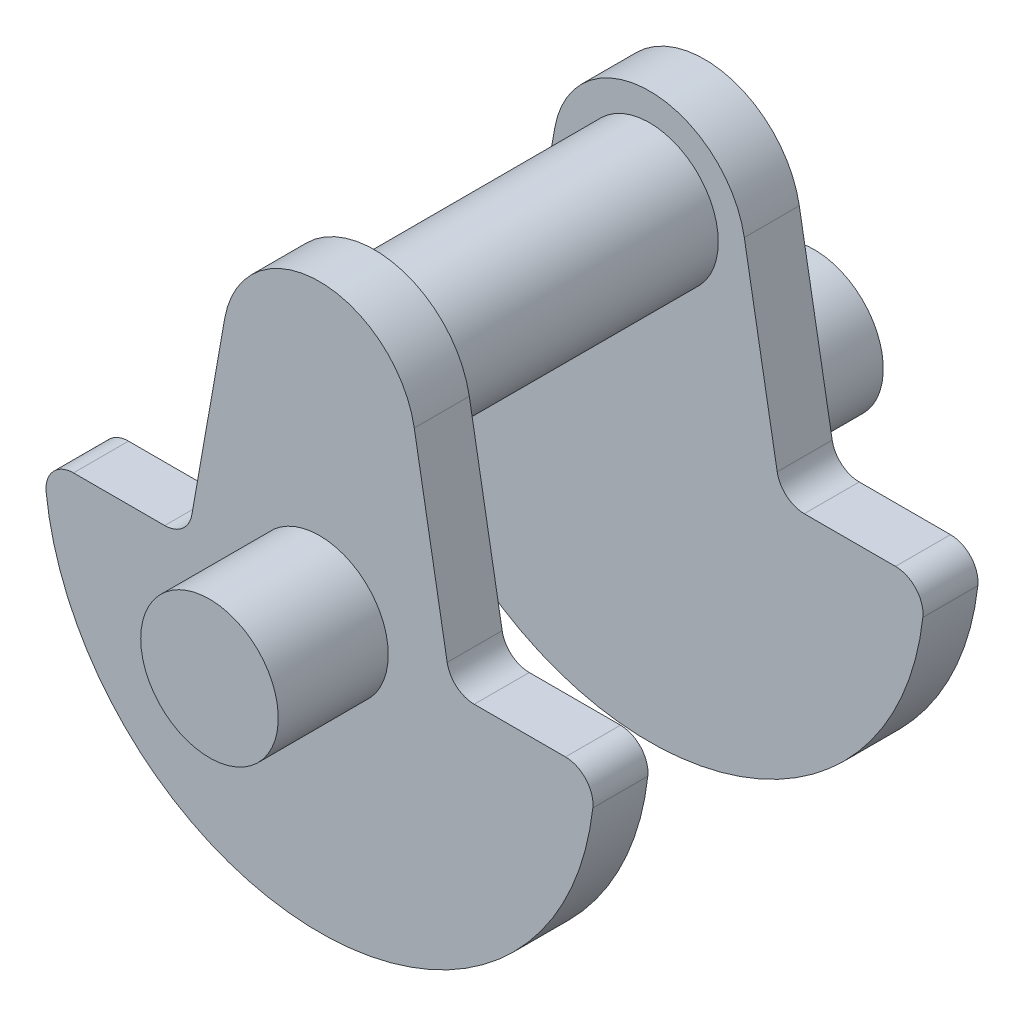
ISO-10303-21;
HEADER;
FILE_DESCRIPTION(('STEP AP214'),'2;1');
FILE_NAME('part.step','',(''),(''),'','','');
FILE_SCHEMA(('AUTOMOTIVE_DESIGN { 1 0 10303 214 1 1 1 1 }'));
ENDSEC;
DATA;
#1=APPLICATION_CONTEXT('core data for automotive mechanical design processes');
#2=APPLICATION_PROTOCOL_DEFINITION('international standard','automotive_design',2000,#1);
#3=PRODUCT_CONTEXT('',#1,'mechanical');
#4=PRODUCT('Part','Part','',(#3));
#5=PRODUCT_RELATED_PRODUCT_CATEGORY('part','',(#4));
#6=PRODUCT_DEFINITION_FORMATION('','',#4);
#7=PRODUCT_DEFINITION_CONTEXT('part definition',#1,'design');
#8=PRODUCT_DEFINITION('design','',#6,#7);
#9=PRODUCT_DEFINITION_SHAPE('','',#8);
#10=(LENGTH_UNIT() NAMED_UNIT(*) SI_UNIT(.MILLI.,.METRE.));
#11=(NAMED_UNIT(*) PLANE_ANGLE_UNIT() SI_UNIT($,.RADIAN.));
#12=(NAMED_UNIT(*) SI_UNIT($,.STERADIAN.) SOLID_ANGLE_UNIT());
#13=UNCERTAINTY_MEASURE_WITH_UNIT(LENGTH_MEASURE(1.E-05),#10,'distance_accuracy_value','');
#14=(GEOMETRIC_REPRESENTATION_CONTEXT(3) GLOBAL_UNCERTAINTY_ASSIGNED_CONTEXT((#13)) GLOBAL_UNIT_ASSIGNED_CONTEXT((#10,
#11,#12)) REPRESENTATION_CONTEXT('',''));
#15=CARTESIAN_POINT('',(0.,0.,0.));
#16=DIRECTION('',(0.,0.,1.));
#17=DIRECTION('',(1.,0.,0.));
#18=AXIS2_PLACEMENT_3D('',#15,#16,#17);
#19=CARTESIAN_POINT('',(28.136908188683,5.,10.));
#20=DIRECTION('',(0.,0.,-1.));
#21=DIRECTION('',(-1.,0.,0.));
#22=AXIS2_PLACEMENT_3D('',#19,#20,#21);
#23=PLANE('',#22);
#24=CARTESIAN_POINT('',(28.136908188683,5.,10.));
#25=DIRECTION('',(0.,0.,-1.));
#26=DIRECTION('',(-1.,0.,0.));
#27=AXIS2_PLACEMENT_3D('',#24,#25,#26);
#28=CIRCLE('',#27,5.);
#29=CARTESIAN_POINT('',(28.136908188683,0.,10.));
#30=VERTEX_POINT('',#29);
#31=CARTESIAN_POINT('',(23.2128694236219,4.13175911166541,10.));
#32=VERTEX_POINT('',#31);
#33=EDGE_CURVE('E170',#30,#32,#28,.T.);
#34=ORIENTED_EDGE('',*,*,#33,.T.);
#35=DIRECTION('',(-0.173648177666923,0.984807753012209,0.));
#36=VECTOR('',#35,1.);
#37=CARTESIAN_POINT('',(23.2128694236219,4.13175911166541,10.));
#38=LINE('',#37,#36);
#39=CARTESIAN_POINT('',(17.2341356777137,38.0388431091712,10.));
#40=VERTEX_POINT('',#39);
#41=EDGE_CURVE('E105',#32,#40,#38,.T.);
#42=ORIENTED_EDGE('',*,*,#41,.T.);
#43=CARTESIAN_POINT('',(0.,35.,10.));
#44=DIRECTION('',(0.,0.,1.));
#45=DIRECTION('',(1.,0.,0.));
#46=AXIS2_PLACEMENT_3D('',#43,#44,#45);
#47=CIRCLE('',#46,17.5);
#48=CARTESIAN_POINT('',(-17.2341356777137,38.0388431091712,10.));
#49=VERTEX_POINT('',#48);
#50=EDGE_CURVE('E209',#40,#49,#47,.T.);
#51=ORIENTED_EDGE('',*,*,#50,.T.);
#52=DIRECTION('',(-0.173648177666923,-0.984807753012209,0.));
#53=VECTOR('',#52,1.);
#54=CARTESIAN_POINT('',(-23.2128694236219,4.13175911166541,10.));
#55=LINE('',#54,#53);
#56=CARTESIAN_POINT('',(-23.2128694236219,4.13175911166541,10.));
#57=VERTEX_POINT('',#56);
#58=EDGE_CURVE('E206',#49,#57,#55,.T.);
#59=ORIENTED_EDGE('',*,*,#58,.T.);
#60=CARTESIAN_POINT('',(-28.136908188683,5.,10.));
#61=DIRECTION('',(0.,0.,-1.));
#62=DIRECTION('',(1.,0.,0.));
#63=AXIS2_PLACEMENT_3D('',#60,#61,#62);
#64=CIRCLE('',#63,5.);
#65=CARTESIAN_POINT('',(-28.136908188683,0.,10.));
#66=VERTEX_POINT('',#65);
#67=EDGE_CURVE('E208',#57,#66,#64,.T.);
#68=ORIENTED_EDGE('',*,*,#67,.T.);
#69=DIRECTION('',(-1.,0.,0.));
#70=VECTOR('',#69,1.);
#71=CARTESIAN_POINT('',(-44.7213595499958,0.,10.));
#72=LINE('',#71,#70);
#73=CARTESIAN_POINT('',(-44.7213595499958,0.,10.));
#74=VERTEX_POINT('',#73);
#75=EDGE_CURVE('E211',#66,#74,#72,.T.);
#76=ORIENTED_EDGE('',*,*,#75,.T.);
#77=CARTESIAN_POINT('',(-44.7213595499958,-5.,10.));
#78=DIRECTION('',(0.,0.,1.));
#79=DIRECTION('',(-1.,0.,0.));
#80=AXIS2_PLACEMENT_3D('',#77,#78,#79);
#81=CIRCLE('',#80,5.);
#82=CARTESIAN_POINT('',(-49.6903994999953,-5.55555555555555,10.));
#83=VERTEX_POINT('',#82);
#84=EDGE_CURVE('E133',#74,#83,#81,.T.);
#85=ORIENTED_EDGE('',*,*,#84,.T.);
#86=CARTESIAN_POINT('',(0.,0.,10.));
#87=DIRECTION('',(0.,0.,1.));
#88=DIRECTION('',(1.,0.,0.));
#89=AXIS2_PLACEMENT_3D('',#86,#87,#88);
#90=CIRCLE('',#89,50.);
#91=CARTESIAN_POINT('',(49.6903994999953,-5.55555555555555,10.));
#92=VERTEX_POINT('',#91);
#93=EDGE_CURVE('E127',#83,#92,#90,.T.);
#94=ORIENTED_EDGE('',*,*,#93,.T.);
#95=CARTESIAN_POINT('',(44.7213595499958,-5.,10.));
#96=DIRECTION('',(0.,0.,1.));
#97=DIRECTION('',(1.,0.,0.));
#98=AXIS2_PLACEMENT_3D('',#95,#96,#97);
#99=CIRCLE('',#98,5.);
#100=CARTESIAN_POINT('',(44.7213595499958,0.,10.));
#101=VERTEX_POINT('',#100);
#102=EDGE_CURVE('E131',#92,#101,#99,.T.);
#103=ORIENTED_EDGE('',*,*,#102,.T.);
#104=DIRECTION('',(-1.,0.,0.));
#105=VECTOR('',#104,1.);
#106=CARTESIAN_POINT('',(44.7213595499958,0.,10.));
#107=LINE('',#106,#105);
#108=EDGE_CURVE('E54',#101,#30,#107,.T.);
#109=ORIENTED_EDGE('',*,*,#108,.T.);
#110=EDGE_LOOP('',(#34,#42,#51,#59,#68,#76,#85,#94,#103,#109));
#111=FACE_BOUND('',#110,.T.);
#112=CARTESIAN_POINT('',(0.,0.,10.));
#113=DIRECTION('',(0.,0.,1.));
#114=DIRECTION('',(1.,0.,0.));
#115=AXIS2_PLACEMENT_3D('',#112,#113,#114);
#116=CIRCLE('',#115,12.5);
#117=CARTESIAN_POINT('',(12.5,0.,10.));
#118=VERTEX_POINT('',#117);
#119=EDGE_CURVE('E155',#118,#118,#116,.T.);
#120=ORIENTED_EDGE('',*,*,#119,.F.);
#121=EDGE_LOOP('',(#120));
#122=FACE_BOUND('',#121,.T.);
#123=ADVANCED_FACE('F37',(#111,#122),#23,.F.);
#124=CARTESIAN_POINT('',(28.136908188683,5.,0.));
#125=DIRECTION('',(0.,0.,-1.));
#126=DIRECTION('',(-1.,0.,0.));
#127=AXIS2_PLACEMENT_3D('',#124,#125,#126);
#128=PLANE('',#127);
#129=CARTESIAN_POINT('',(0.,35.,0.));
#130=DIRECTION('',(0.,0.,-1.));
#131=DIRECTION('',(-1.,0.,0.));
#132=AXIS2_PLACEMENT_3D('',#129,#130,#131);
#133=CIRCLE('',#132,12.5);
#134=CARTESIAN_POINT('',(-12.5,35.,0.));
#135=VERTEX_POINT('',#134);
#136=EDGE_CURVE('E666',#135,#135,#133,.T.);
#137=ORIENTED_EDGE('',*,*,#136,.F.);
#138=EDGE_LOOP('',(#137));
#139=FACE_BOUND('',#138,.T.);
#140=CARTESIAN_POINT('',(28.136908188683,5.,0.));
#141=DIRECTION('',(0.,0.,-1.));
#142=DIRECTION('',(-1.,0.,0.));
#143=AXIS2_PLACEMENT_3D('',#140,#141,#142);
#144=CIRCLE('',#143,5.);
#145=CARTESIAN_POINT('',(28.136908188683,0.,0.));
#146=VERTEX_POINT('',#145);
#147=CARTESIAN_POINT('',(23.2128694236219,4.13175911166541,0.));
#148=VERTEX_POINT('',#147);
#149=EDGE_CURVE('E151',#146,#148,#144,.T.);
#150=ORIENTED_EDGE('',*,*,#149,.F.);
#151=DIRECTION('',(-1.,0.,0.));
#152=VECTOR('',#151,1.);
#153=CARTESIAN_POINT('',(44.7213595499958,0.,0.));
#154=LINE('',#153,#152);
#155=CARTESIAN_POINT('',(44.7213595499958,0.,0.));
#156=VERTEX_POINT('',#155);
#157=EDGE_CURVE('E96',#156,#146,#154,.T.);
#158=ORIENTED_EDGE('',*,*,#157,.F.);
#159=CARTESIAN_POINT('',(44.7213595499958,-5.,0.));
#160=DIRECTION('',(0.,0.,1.));
#161=DIRECTION('',(1.,0.,0.));
#162=AXIS2_PLACEMENT_3D('',#159,#160,#161);
#163=CIRCLE('',#162,5.);
#164=CARTESIAN_POINT('',(49.6903994999953,-5.55555555555555,0.));
#165=VERTEX_POINT('',#164);
#166=EDGE_CURVE('E90',#165,#156,#163,.T.);
#167=ORIENTED_EDGE('',*,*,#166,.F.);
#168=CARTESIAN_POINT('',(0.,0.,0.));
#169=DIRECTION('',(0.,0.,1.));
#170=DIRECTION('',(1.,0.,0.));
#171=AXIS2_PLACEMENT_3D('',#168,#169,#170);
#172=CIRCLE('',#171,50.);
#173=CARTESIAN_POINT('',(-49.6903994999953,-5.55555555555555,0.));
#174=VERTEX_POINT('',#173);
#175=EDGE_CURVE('E141',#174,#165,#172,.T.);
#176=ORIENTED_EDGE('',*,*,#175,.F.);
#177=CARTESIAN_POINT('',(-44.7213595499958,-5.,0.));
#178=DIRECTION('',(0.,0.,1.));
#179=DIRECTION('',(-1.,0.,0.));
#180=AXIS2_PLACEMENT_3D('',#177,#178,#179);
#181=CIRCLE('',#180,5.);
#182=CARTESIAN_POINT('',(-44.7213595499958,0.,0.));
#183=VERTEX_POINT('',#182);
#184=EDGE_CURVE('E165',#183,#174,#181,.T.);
#185=ORIENTED_EDGE('',*,*,#184,.F.);
#186=DIRECTION('',(-1.,0.,0.));
#187=VECTOR('',#186,1.);
#188=CARTESIAN_POINT('',(-44.7213595499958,0.,0.));
#189=LINE('',#188,#187);
#190=CARTESIAN_POINT('',(-28.136908188683,0.,0.));
#191=VERTEX_POINT('',#190);
#192=EDGE_CURVE('E163',#191,#183,#189,.T.);
#193=ORIENTED_EDGE('',*,*,#192,.F.);
#194=CARTESIAN_POINT('',(-28.136908188683,5.,0.));
#195=DIRECTION('',(0.,0.,-1.));
#196=DIRECTION('',(1.,0.,0.));
#197=AXIS2_PLACEMENT_3D('',#194,#195,#196);
#198=CIRCLE('',#197,5.);
#199=CARTESIAN_POINT('',(-23.2128694236219,4.13175911166541,0.));
#200=VERTEX_POINT('',#199);
#201=EDGE_CURVE('E161',#200,#191,#198,.T.);
#202=ORIENTED_EDGE('',*,*,#201,.F.);
#203=DIRECTION('',(-0.173648177666923,-0.984807753012209,0.));
#204=VECTOR('',#203,1.);
#205=CARTESIAN_POINT('',(-23.2128694236219,4.13175911166541,0.));
#206=LINE('',#205,#204);
#207=CARTESIAN_POINT('',(-17.2341356777137,38.0388431091712,0.));
#208=VERTEX_POINT('',#207);
#209=EDGE_CURVE('E159',#208,#200,#206,.T.);
#210=ORIENTED_EDGE('',*,*,#209,.F.);
#211=CARTESIAN_POINT('',(0.,35.,0.));
#212=DIRECTION('',(0.,0.,1.));
#213=DIRECTION('',(1.,0.,0.));
#214=AXIS2_PLACEMENT_3D('',#211,#212,#213);
#215=CIRCLE('',#214,17.5);
#216=CARTESIAN_POINT('',(17.2341356777137,38.0388431091712,0.));
#217=VERTEX_POINT('',#216);
#218=EDGE_CURVE('E157',#217,#208,#215,.T.);
#219=ORIENTED_EDGE('',*,*,#218,.F.);
#220=DIRECTION('',(-0.173648177666923,0.984807753012209,0.));
#221=VECTOR('',#220,1.);
#222=CARTESIAN_POINT('',(23.2128694236219,4.13175911166541,0.));
#223=LINE('',#222,#221);
#224=EDGE_CURVE('E154',#148,#217,#223,.T.);
#225=ORIENTED_EDGE('',*,*,#224,.F.);
#226=EDGE_LOOP('',(#150,#158,#167,#176,#185,#193,#202,#210,#219,#225));
#227=FACE_BOUND('',#226,.T.);
#228=ADVANCED_FACE('F194',(#139,#227),#128,.T.);
#229=CARTESIAN_POINT('',(28.136908188683,5.,10.));
#230=DIRECTION('',(0.,0.,-1.));
#231=DIRECTION('',(-1.,0.,0.));
#232=AXIS2_PLACEMENT_3D('',#229,#230,#231);
#233=CYLINDRICAL_SURFACE('',#232,5.);
#234=ORIENTED_EDGE('',*,*,#149,.T.);
#235=DIRECTION('',(0.,0.,-1.));
#236=VECTOR('',#235,1.);
#237=CARTESIAN_POINT('',(23.2128694236219,4.13175911166541,10.));
#238=LINE('',#237,#236);
#239=EDGE_CURVE('E46',#32,#148,#238,.T.);
#240=ORIENTED_EDGE('',*,*,#239,.F.);
#241=ORIENTED_EDGE('',*,*,#33,.F.);
#242=DIRECTION('',(0.,0.,-1.));
#243=VECTOR('',#242,1.);
#244=CARTESIAN_POINT('',(28.136908188683,0.,10.));
#245=LINE('',#244,#243);
#246=EDGE_CURVE('E147',#30,#146,#245,.T.);
#247=ORIENTED_EDGE('',*,*,#246,.T.);
#248=EDGE_LOOP('',(#234,#240,#241,#247));
#249=FACE_BOUND('',#248,.T.);
#250=ADVANCED_FACE('F39',(#249),#233,.F.);
#251=CARTESIAN_POINT('',(23.2128694236219,4.13175911166541,10.));
#252=DIRECTION('',(-0.984807753012209,-0.173648177666923,0.));
#253=DIRECTION('',(0.173648177666923,-0.984807753012209,0.));
#254=AXIS2_PLACEMENT_3D('',#251,#252,#253);
#255=PLANE('',#254);
#256=ORIENTED_EDGE('',*,*,#224,.T.);
#257=DIRECTION('',(0.,0.,-1.));
#258=VECTOR('',#257,1.);
#259=CARTESIAN_POINT('',(17.2341356777137,38.0388431091712,10.));
#260=LINE('',#259,#258);
#261=EDGE_CURVE('E186',#40,#217,#260,.T.);
#262=ORIENTED_EDGE('',*,*,#261,.F.);
#263=ORIENTED_EDGE('',*,*,#41,.F.);
#264=ORIENTED_EDGE('',*,*,#239,.T.);
#265=EDGE_LOOP('',(#256,#262,#263,#264));
#266=FACE_BOUND('',#265,.T.);
#267=ADVANCED_FACE('F189',(#266),#255,.F.);
#268=CARTESIAN_POINT('',(0.,35.,10.));
#269=DIRECTION('',(0.,0.,-1.));
#270=DIRECTION('',(-1.,0.,0.));
#271=AXIS2_PLACEMENT_3D('',#268,#269,#270);
#272=CYLINDRICAL_SURFACE('',#271,17.5);
#273=ORIENTED_EDGE('',*,*,#218,.T.);
#274=DIRECTION('',(0.,0.,-1.));
#275=VECTOR('',#274,1.);
#276=CARTESIAN_POINT('',(-17.2341356777137,38.0388431091712,10.));
#277=LINE('',#276,#275);
#278=EDGE_CURVE('E183',#49,#208,#277,.T.);
#279=ORIENTED_EDGE('',*,*,#278,.F.);
#280=ORIENTED_EDGE('',*,*,#50,.F.);
#281=ORIENTED_EDGE('',*,*,#261,.T.);
#282=EDGE_LOOP('',(#273,#279,#280,#281));
#283=FACE_BOUND('',#282,.T.);
#284=ADVANCED_FACE('F200',(#283),#272,.T.);
#285=CARTESIAN_POINT('',(-23.2128694236219,4.13175911166541,10.));
#286=DIRECTION('',(0.984807753012209,-0.173648177666923,0.));
#287=DIRECTION('',(0.173648177666923,0.984807753012209,0.));
#288=AXIS2_PLACEMENT_3D('',#285,#286,#287);
#289=PLANE('',#288);
#290=ORIENTED_EDGE('',*,*,#209,.T.);
#291=DIRECTION('',(0.,0.,-1.));
#292=VECTOR('',#291,1.);
#293=CARTESIAN_POINT('',(-23.2128694236219,4.13175911166541,10.));
#294=LINE('',#293,#292);
#295=EDGE_CURVE('E180',#57,#200,#294,.T.);
#296=ORIENTED_EDGE('',*,*,#295,.F.);
#297=ORIENTED_EDGE('',*,*,#58,.F.);
#298=ORIENTED_EDGE('',*,*,#278,.T.);
#299=EDGE_LOOP('',(#290,#296,#297,#298));
#300=FACE_BOUND('',#299,.T.);
#301=ADVANCED_FACE('F204',(#300),#289,.F.);
#302=CARTESIAN_POINT('',(-28.136908188683,5.,10.));
#303=DIRECTION('',(0.,0.,-1.));
#304=DIRECTION('',(-1.,0.,0.));
#305=AXIS2_PLACEMENT_3D('',#302,#303,#304);
#306=CYLINDRICAL_SURFACE('',#305,5.);
#307=ORIENTED_EDGE('',*,*,#201,.T.);
#308=DIRECTION('',(0.,0.,-1.));
#309=VECTOR('',#308,1.);
#310=CARTESIAN_POINT('',(-28.136908188683,0.,10.));
#311=LINE('',#310,#309);
#312=EDGE_CURVE('E177',#66,#191,#311,.T.);
#313=ORIENTED_EDGE('',*,*,#312,.F.);
#314=ORIENTED_EDGE('',*,*,#67,.F.);
#315=ORIENTED_EDGE('',*,*,#295,.T.);
#316=EDGE_LOOP('',(#307,#313,#314,#315));
#317=FACE_BOUND('',#316,.T.);
#318=ADVANCED_FACE('F226',(#317),#306,.F.);
#319=CARTESIAN_POINT('',(-44.7213595499958,0.,10.));
#320=DIRECTION('',(0.,-1.,0.));
#321=DIRECTION('',(0.,0.,-1.));
#322=AXIS2_PLACEMENT_3D('',#319,#320,#321);
#323=PLANE('',#322);
#324=ORIENTED_EDGE('',*,*,#192,.T.);
#325=DIRECTION('',(0.,0.,-1.));
#326=VECTOR('',#325,1.);
#327=CARTESIAN_POINT('',(-44.7213595499958,0.,10.));
#328=LINE('',#327,#326);
#329=EDGE_CURVE('E174',#74,#183,#328,.T.);
#330=ORIENTED_EDGE('',*,*,#329,.F.);
#331=ORIENTED_EDGE('',*,*,#75,.F.);
#332=ORIENTED_EDGE('',*,*,#312,.T.);
#333=EDGE_LOOP('',(#324,#330,#331,#332));
#334=FACE_BOUND('',#333,.T.);
#335=ADVANCED_FACE('F220',(#334),#323,.F.);
#336=CARTESIAN_POINT('',(-44.7213595499958,-5.,10.));
#337=DIRECTION('',(0.,0.,-1.));
#338=DIRECTION('',(-1.,0.,0.));
#339=AXIS2_PLACEMENT_3D('',#336,#337,#338);
#340=CYLINDRICAL_SURFACE('',#339,5.);
#341=ORIENTED_EDGE('',*,*,#184,.T.);
#342=DIRECTION('',(0.,0.,-1.));
#343=VECTOR('',#342,1.);
#344=CARTESIAN_POINT('',(-49.6903994999953,-5.55555555555555,10.));
#345=LINE('',#344,#343);
#346=EDGE_CURVE('E142',#83,#174,#345,.T.);
#347=ORIENTED_EDGE('',*,*,#346,.F.);
#348=ORIENTED_EDGE('',*,*,#84,.F.);
#349=ORIENTED_EDGE('',*,*,#329,.T.);
#350=EDGE_LOOP('',(#341,#347,#348,#349));
#351=FACE_BOUND('',#350,.T.);
#352=ADVANCED_FACE('F224',(#351),#340,.T.);
#353=CARTESIAN_POINT('',(0.,0.,10.));
#354=DIRECTION('',(0.,0.,-1.));
#355=DIRECTION('',(-1.,0.,0.));
#356=AXIS2_PLACEMENT_3D('',#353,#354,#355);
#357=CYLINDRICAL_SURFACE('',#356,50.);
#358=ORIENTED_EDGE('',*,*,#175,.T.);
#359=DIRECTION('',(0.,0.,-1.));
#360=VECTOR('',#359,1.);
#361=CARTESIAN_POINT('',(49.6903994999953,-5.55555555555555,10.));
#362=LINE('',#361,#360);
#363=EDGE_CURVE('E138',#92,#165,#362,.T.);
#364=ORIENTED_EDGE('',*,*,#363,.F.);
#365=ORIENTED_EDGE('',*,*,#93,.F.);
#366=ORIENTED_EDGE('',*,*,#346,.T.);
#367=EDGE_LOOP('',(#358,#364,#365,#366));
#368=FACE_BOUND('',#367,.T.);
#369=ADVANCED_FACE('F139',(#368),#357,.T.);
#370=CARTESIAN_POINT('',(44.7213595499958,-5.,10.));
#371=DIRECTION('',(0.,0.,-1.));
#372=DIRECTION('',(-1.,0.,0.));
#373=AXIS2_PLACEMENT_3D('',#370,#371,#372);
#374=CYLINDRICAL_SURFACE('',#373,5.);
#375=ORIENTED_EDGE('',*,*,#166,.T.);
#376=DIRECTION('',(0.,0.,-1.));
#377=VECTOR('',#376,1.);
#378=CARTESIAN_POINT('',(44.7213595499958,0.,10.));
#379=LINE('',#378,#377);
#380=EDGE_CURVE('E143',#101,#156,#379,.T.);
#381=ORIENTED_EDGE('',*,*,#380,.F.);
#382=ORIENTED_EDGE('',*,*,#102,.F.);
#383=ORIENTED_EDGE('',*,*,#363,.T.);
#384=EDGE_LOOP('',(#375,#381,#382,#383));
#385=FACE_BOUND('',#384,.T.);
#386=ADVANCED_FACE('F145',(#385),#374,.T.);
#387=CARTESIAN_POINT('',(44.7213595499958,0.,10.));
#388=DIRECTION('',(0.,-1.,0.));
#389=DIRECTION('',(0.,0.,-1.));
#390=AXIS2_PLACEMENT_3D('',#387,#388,#389);
#391=PLANE('',#390);
#392=ORIENTED_EDGE('',*,*,#157,.T.);
#393=ORIENTED_EDGE('',*,*,#246,.F.);
#394=ORIENTED_EDGE('',*,*,#108,.F.);
#395=ORIENTED_EDGE('',*,*,#380,.T.);
#396=EDGE_LOOP('',(#392,#393,#394,#395));
#397=FACE_BOUND('',#396,.T.);
#398=ADVANCED_FACE('F246',(#397),#391,.F.);
#399=CARTESIAN_POINT('',(0.,0.,30.));
#400=DIRECTION('',(0.,0.,-1.));
#401=DIRECTION('',(-1.,0.,0.));
#402=AXIS2_PLACEMENT_3D('',#399,#400,#401);
#403=CYLINDRICAL_SURFACE('',#402,12.5);
#404=CARTESIAN_POINT('',(0.,0.,30.));
#405=DIRECTION('',(0.,0.,-1.));
#406=DIRECTION('',(-1.,0.,0.));
#407=AXIS2_PLACEMENT_3D('',#404,#405,#406);
#408=CIRCLE('',#407,12.5);
#409=CARTESIAN_POINT('',(-12.5,0.,30.));
#410=VERTEX_POINT('',#409);
#411=EDGE_CURVE('E669',#410,#410,#408,.T.);
#412=ORIENTED_EDGE('',*,*,#411,.T.);
#413=EDGE_LOOP('',(#412));
#414=FACE_BOUND('',#413,.T.);
#415=ORIENTED_EDGE('',*,*,#119,.T.);
#416=EDGE_LOOP('',(#415));
#417=FACE_BOUND('',#416,.T.);
#418=ADVANCED_FACE('F243',(#414,#417),#403,.T.);
#419=CARTESIAN_POINT('',(0.,0.,30.));
#420=DIRECTION('',(0.,0.,-1.));
#421=DIRECTION('',(-1.,0.,0.));
#422=AXIS2_PLACEMENT_3D('',#419,#420,#421);
#423=PLANE('',#422);
#424=ORIENTED_EDGE('',*,*,#411,.F.);
#425=EDGE_LOOP('',(#424));
#426=FACE_BOUND('',#425,.T.);
#427=ADVANCED_FACE('F276',(#426),#423,.F.);
#428=CARTESIAN_POINT('',(0.,35.,-25.));
#429=DIRECTION('',(0.,0.,1.));
#430=DIRECTION('',(1.,0.,0.));
#431=AXIS2_PLACEMENT_3D('',#428,#429,#430);
#432=CYLINDRICAL_SURFACE('',#431,12.5);
#433=CARTESIAN_POINT('',(0.,35.,-50.));
#434=DIRECTION('',(0.,0.,1.));
#435=DIRECTION('',(1.,0.,0.));
#436=AXIS2_PLACEMENT_3D('',#433,#434,#435);
#437=CIRCLE('',#436,12.5);
#438=CARTESIAN_POINT('',(12.5,35.,-50.));
#439=VERTEX_POINT('',#438);
#440=EDGE_CURVE('E11',#439,#439,#437,.F.);
#441=ORIENTED_EDGE('',*,*,#440,.F.);
#442=EDGE_LOOP('',(#441));
#443=FACE_BOUND('',#442,.T.);
#444=ORIENTED_EDGE('',*,*,#136,.T.);
#445=EDGE_LOOP('',(#444));
#446=FACE_BOUND('',#445,.T.);
#447=ADVANCED_FACE('F283',(#443,#446),#432,.T.);
#448=CARTESIAN_POINT('',(28.136908188683,5.,-60.));
#449=DIRECTION('',(0.,0.,1.));
#450=DIRECTION('',(1.,0.,0.));
#451=AXIS2_PLACEMENT_3D('',#448,#449,#450);
#452=CYLINDRICAL_SURFACE('',#451,5.);
#453=CARTESIAN_POINT('',(28.136908188683,5.,-50.));
#454=DIRECTION('',(0.,0.,-1.));
#455=DIRECTION('',(-1.,0.,0.));
#456=AXIS2_PLACEMENT_3D('',#453,#454,#455);
#457=CIRCLE('',#456,5.);
#458=CARTESIAN_POINT('',(28.136908188683,0.,-50.));
#459=VERTEX_POINT('',#458);
#460=CARTESIAN_POINT('',(23.2128694236219,4.13175911166541,-50.));
#461=VERTEX_POINT('',#460);
#462=EDGE_CURVE('E574',#459,#461,#457,.T.);
#463=ORIENTED_EDGE('',*,*,#462,.F.);
#464=DIRECTION('',(0.,0.,1.));
#465=VECTOR('',#464,1.);
#466=CARTESIAN_POINT('',(28.136908188683,0.,-60.));
#467=LINE('',#466,#465);
#468=CARTESIAN_POINT('',(28.136908188683,0.,-60.));
#469=VERTEX_POINT('',#468);
#470=EDGE_CURVE('E663',#469,#459,#467,.T.);
#471=ORIENTED_EDGE('',*,*,#470,.F.);
#472=CARTESIAN_POINT('',(28.136908188683,5.,-60.));
#473=DIRECTION('',(0.,0.,-1.));
#474=DIRECTION('',(-1.,0.,0.));
#475=AXIS2_PLACEMENT_3D('',#472,#473,#474);
#476=CIRCLE('',#475,5.);
#477=CARTESIAN_POINT('',(23.2128694236219,4.13175911166541,-60.));
#478=VERTEX_POINT('',#477);
#479=EDGE_CURVE('E577',#469,#478,#476,.T.);
#480=ORIENTED_EDGE('',*,*,#479,.T.);
#481=DIRECTION('',(0.,0.,1.));
#482=VECTOR('',#481,1.);
#483=CARTESIAN_POINT('',(23.2128694236219,4.13175911166541,-60.));
#484=LINE('',#483,#482);
#485=EDGE_CURVE('E608',#478,#461,#484,.T.);
#486=ORIENTED_EDGE('',*,*,#485,.T.);
#487=EDGE_LOOP('',(#463,#471,#480,#486));
#488=FACE_BOUND('',#487,.T.);
#489=ADVANCED_FACE('F290',(#488),#452,.F.);
#490=CARTESIAN_POINT('',(44.7213595499958,0.,-60.));
#491=DIRECTION('',(0.,1.,0.));
#492=DIRECTION('',(0.,0.,1.));
#493=AXIS2_PLACEMENT_3D('',#490,#491,#492);
#494=PLANE('',#493);
#495=DIRECTION('',(-1.,0.,0.));
#496=VECTOR('',#495,1.);
#497=CARTESIAN_POINT('',(44.7213595499958,0.,-50.));
#498=LINE('',#497,#496);
#499=CARTESIAN_POINT('',(44.7213595499958,0.,-50.));
#500=VERTEX_POINT('',#499);
#501=EDGE_CURVE('E611',#500,#459,#498,.T.);
#502=ORIENTED_EDGE('',*,*,#501,.F.);
#503=DIRECTION('',(0.,0.,1.));
#504=VECTOR('',#503,1.);
#505=CARTESIAN_POINT('',(44.7213595499958,0.,-60.));
#506=LINE('',#505,#504);
#507=CARTESIAN_POINT('',(44.7213595499958,0.,-60.));
#508=VERTEX_POINT('',#507);
#509=EDGE_CURVE('E660',#508,#500,#506,.T.);
#510=ORIENTED_EDGE('',*,*,#509,.F.);
#511=DIRECTION('',(-1.,0.,0.));
#512=VECTOR('',#511,1.);
#513=CARTESIAN_POINT('',(44.7213595499958,0.,-60.));
#514=LINE('',#513,#512);
#515=EDGE_CURVE('E580',#508,#469,#514,.T.);
#516=ORIENTED_EDGE('',*,*,#515,.T.);
#517=ORIENTED_EDGE('',*,*,#470,.T.);
#518=EDGE_LOOP('',(#502,#510,#516,#517));
#519=FACE_BOUND('',#518,.T.);
#520=ADVANCED_FACE('F299',(#519),#494,.T.);
#521=CARTESIAN_POINT('',(44.7213595499958,-5.,-60.));
#522=DIRECTION('',(0.,0.,1.));
#523=DIRECTION('',(1.,0.,0.));
#524=AXIS2_PLACEMENT_3D('',#521,#522,#523);
#525=CYLINDRICAL_SURFACE('',#524,5.);
#526=CARTESIAN_POINT('',(44.7213595499958,-5.,-50.));
#527=DIRECTION('',(0.,0.,1.));
#528=DIRECTION('',(1.,0.,0.));
#529=AXIS2_PLACEMENT_3D('',#526,#527,#528);
#530=CIRCLE('',#529,5.);
#531=CARTESIAN_POINT('',(49.6903994999953,-5.55555555555555,-50.));
#532=VERTEX_POINT('',#531);
#533=EDGE_CURVE('E614',#532,#500,#530,.T.);
#534=ORIENTED_EDGE('',*,*,#533,.F.);
#535=DIRECTION('',(0.,0.,1.));
#536=VECTOR('',#535,1.);
#537=CARTESIAN_POINT('',(49.6903994999953,-5.55555555555555,-60.));
#538=LINE('',#537,#536);
#539=CARTESIAN_POINT('',(49.6903994999953,-5.55555555555555,-60.));
#540=VERTEX_POINT('',#539);
#541=EDGE_CURVE('E657',#540,#532,#538,.T.);
#542=ORIENTED_EDGE('',*,*,#541,.F.);
#543=CARTESIAN_POINT('',(44.7213595499958,-5.,-60.));
#544=DIRECTION('',(0.,0.,1.));
#545=DIRECTION('',(1.,0.,0.));
#546=AXIS2_PLACEMENT_3D('',#543,#544,#545);
#547=CIRCLE('',#546,5.);
#548=EDGE_CURVE('E584',#540,#508,#547,.T.);
#549=ORIENTED_EDGE('',*,*,#548,.T.);
#550=ORIENTED_EDGE('',*,*,#509,.T.);
#551=EDGE_LOOP('',(#534,#542,#549,#550));
#552=FACE_BOUND('',#551,.T.);
#553=ADVANCED_FACE('F307',(#552),#525,.T.);
#554=CARTESIAN_POINT('',(0.,0.,-60.));
#555=DIRECTION('',(0.,0.,1.));
#556=DIRECTION('',(1.,0.,0.));
#557=AXIS2_PLACEMENT_3D('',#554,#555,#556);
#558=CYLINDRICAL_SURFACE('',#557,50.);
#559=CARTESIAN_POINT('',(0.,0.,-50.));
#560=DIRECTION('',(0.,0.,1.));
#561=DIRECTION('',(1.,0.,0.));
#562=AXIS2_PLACEMENT_3D('',#559,#560,#561);
#563=CIRCLE('',#562,50.);
#564=CARTESIAN_POINT('',(-49.6903994999953,-5.55555555555555,-50.));
#565=VERTEX_POINT('',#564);
#566=EDGE_CURVE('E617',#565,#532,#563,.T.);
#567=ORIENTED_EDGE('',*,*,#566,.F.);
#568=DIRECTION('',(0.,0.,1.));
#569=VECTOR('',#568,1.);
#570=CARTESIAN_POINT('',(-49.6903994999953,-5.55555555555555,-60.));
#571=LINE('',#570,#569);
#572=CARTESIAN_POINT('',(-49.6903994999953,-5.55555555555555,-60.));
#573=VERTEX_POINT('',#572);
#574=EDGE_CURVE('E654',#573,#565,#571,.T.);
#575=ORIENTED_EDGE('',*,*,#574,.F.);
#576=CARTESIAN_POINT('',(0.,0.,-60.));
#577=DIRECTION('',(0.,0.,1.));
#578=DIRECTION('',(1.,0.,0.));
#579=AXIS2_PLACEMENT_3D('',#576,#577,#578);
#580=CIRCLE('',#579,50.);
#581=EDGE_CURVE('E587',#573,#540,#580,.T.);
#582=ORIENTED_EDGE('',*,*,#581,.T.);
#583=ORIENTED_EDGE('',*,*,#541,.T.);
#584=EDGE_LOOP('',(#567,#575,#582,#583));
#585=FACE_BOUND('',#584,.T.);
#586=ADVANCED_FACE('F315',(#585),#558,.T.);
#587=CARTESIAN_POINT('',(-44.7213595499958,-5.,-60.));
#588=DIRECTION('',(0.,0.,1.));
#589=DIRECTION('',(1.,0.,0.));
#590=AXIS2_PLACEMENT_3D('',#587,#588,#589);
#591=CYLINDRICAL_SURFACE('',#590,5.);
#592=CARTESIAN_POINT('',(-44.7213595499958,-5.,-50.));
#593=DIRECTION('',(0.,0.,1.));
#594=DIRECTION('',(-1.,0.,0.));
#595=AXIS2_PLACEMENT_3D('',#592,#593,#594);
#596=CIRCLE('',#595,5.);
#597=CARTESIAN_POINT('',(-44.7213595499958,0.,-50.));
#598=VERTEX_POINT('',#597);
#599=EDGE_CURVE('E620',#598,#565,#596,.T.);
#600=ORIENTED_EDGE('',*,*,#599,.F.);
#601=DIRECTION('',(0.,0.,1.));
#602=VECTOR('',#601,1.);
#603=CARTESIAN_POINT('',(-44.7213595499958,0.,-60.));
#604=LINE('',#603,#602);
#605=CARTESIAN_POINT('',(-44.7213595499958,0.,-60.));
#606=VERTEX_POINT('',#605);
#607=EDGE_CURVE('E651',#606,#598,#604,.T.);
#608=ORIENTED_EDGE('',*,*,#607,.F.);
#609=CARTESIAN_POINT('',(-44.7213595499958,-5.,-60.));
#610=DIRECTION('',(0.,0.,1.));
#611=DIRECTION('',(-1.,0.,0.));
#612=AXIS2_PLACEMENT_3D('',#609,#610,#611);
#613=CIRCLE('',#612,5.);
#614=EDGE_CURVE('E590',#606,#573,#613,.T.);
#615=ORIENTED_EDGE('',*,*,#614,.T.);
#616=ORIENTED_EDGE('',*,*,#574,.T.);
#617=EDGE_LOOP('',(#600,#608,#615,#616));
#618=FACE_BOUND('',#617,.T.);
#619=ADVANCED_FACE('F323',(#618),#591,.T.);
#620=CARTESIAN_POINT('',(-44.7213595499958,0.,-60.));
#621=DIRECTION('',(0.,1.,0.));
#622=DIRECTION('',(0.,0.,1.));
#623=AXIS2_PLACEMENT_3D('',#620,#621,#622);
#624=PLANE('',#623);
#625=DIRECTION('',(-1.,0.,0.));
#626=VECTOR('',#625,1.);
#627=CARTESIAN_POINT('',(-44.7213595499958,0.,-50.));
#628=LINE('',#627,#626);
#629=CARTESIAN_POINT('',(-28.136908188683,0.,-50.));
#630=VERTEX_POINT('',#629);
#631=EDGE_CURVE('E623',#630,#598,#628,.T.);
#632=ORIENTED_EDGE('',*,*,#631,.F.);
#633=DIRECTION('',(0.,0.,1.));
#634=VECTOR('',#633,1.);
#635=CARTESIAN_POINT('',(-28.136908188683,0.,-60.));
#636=LINE('',#635,#634);
#637=CARTESIAN_POINT('',(-28.136908188683,0.,-60.));
#638=VERTEX_POINT('',#637);
#639=EDGE_CURVE('E648',#638,#630,#636,.T.);
#640=ORIENTED_EDGE('',*,*,#639,.F.);
#641=DIRECTION('',(-1.,0.,0.));
#642=VECTOR('',#641,1.);
#643=CARTESIAN_POINT('',(-44.7213595499958,0.,-60.));
#644=LINE('',#643,#642);
#645=EDGE_CURVE('E593',#638,#606,#644,.T.);
#646=ORIENTED_EDGE('',*,*,#645,.T.);
#647=ORIENTED_EDGE('',*,*,#607,.T.);
#648=EDGE_LOOP('',(#632,#640,#646,#647));
#649=FACE_BOUND('',#648,.T.);
#650=ADVANCED_FACE('F331',(#649),#624,.T.);
#651=CARTESIAN_POINT('',(-28.136908188683,5.,-60.));
#652=DIRECTION('',(0.,0.,1.));
#653=DIRECTION('',(1.,0.,0.));
#654=AXIS2_PLACEMENT_3D('',#651,#652,#653);
#655=CYLINDRICAL_SURFACE('',#654,5.);
#656=CARTESIAN_POINT('',(-28.136908188683,5.,-50.));
#657=DIRECTION('',(0.,0.,-1.));
#658=DIRECTION('',(1.,0.,0.));
#659=AXIS2_PLACEMENT_3D('',#656,#657,#658);
#660=CIRCLE('',#659,5.);
#661=CARTESIAN_POINT('',(-23.2128694236219,4.13175911166541,-50.));
#662=VERTEX_POINT('',#661);
#663=EDGE_CURVE('E626',#662,#630,#660,.T.);
#664=ORIENTED_EDGE('',*,*,#663,.F.);
#665=DIRECTION('',(0.,0.,1.));
#666=VECTOR('',#665,1.);
#667=CARTESIAN_POINT('',(-23.2128694236219,4.13175911166541,-60.));
#668=LINE('',#667,#666);
#669=CARTESIAN_POINT('',(-23.2128694236219,4.13175911166541,-60.));
#670=VERTEX_POINT('',#669);
#671=EDGE_CURVE('E645',#670,#662,#668,.T.);
#672=ORIENTED_EDGE('',*,*,#671,.F.);
#673=CARTESIAN_POINT('',(-28.136908188683,5.,-60.));
#674=DIRECTION('',(0.,0.,-1.));
#675=DIRECTION('',(1.,0.,0.));
#676=AXIS2_PLACEMENT_3D('',#673,#674,#675);
#677=CIRCLE('',#676,5.);
#678=EDGE_CURVE('E596',#670,#638,#677,.T.);
#679=ORIENTED_EDGE('',*,*,#678,.T.);
#680=ORIENTED_EDGE('',*,*,#639,.T.);
#681=EDGE_LOOP('',(#664,#672,#679,#680));
#682=FACE_BOUND('',#681,.T.);
#683=ADVANCED_FACE('F339',(#682),#655,.F.);
#684=CARTESIAN_POINT('',(-23.2128694236219,4.13175911166541,-60.));
#685=DIRECTION('',(-0.984807753012209,0.173648177666923,0.));
#686=DIRECTION('',(-0.173648177666923,-0.984807753012209,0.));
#687=AXIS2_PLACEMENT_3D('',#684,#685,#686);
#688=PLANE('',#687);
#689=DIRECTION('',(-0.173648177666923,-0.984807753012209,0.));
#690=VECTOR('',#689,1.);
#691=CARTESIAN_POINT('',(-23.2128694236219,4.13175911166541,-50.));
#692=LINE('',#691,#690);
#693=CARTESIAN_POINT('',(-17.2341356777137,38.0388431091712,-50.));
#694=VERTEX_POINT('',#693);
#695=EDGE_CURVE('E629',#694,#662,#692,.T.);
#696=ORIENTED_EDGE('',*,*,#695,.F.);
#697=DIRECTION('',(0.,0.,1.));
#698=VECTOR('',#697,1.);
#699=CARTESIAN_POINT('',(-17.2341356777137,38.0388431091712,-60.));
#700=LINE('',#699,#698);
#701=CARTESIAN_POINT('',(-17.2341356777137,38.0388431091712,-60.));
#702=VERTEX_POINT('',#701);
#703=EDGE_CURVE('E642',#702,#694,#700,.T.);
#704=ORIENTED_EDGE('',*,*,#703,.F.);
#705=DIRECTION('',(-0.173648177666923,-0.984807753012209,0.));
#706=VECTOR('',#705,1.);
#707=CARTESIAN_POINT('',(-23.2128694236219,4.13175911166541,-60.));
#708=LINE('',#707,#706);
#709=EDGE_CURVE('E599',#702,#670,#708,.T.);
#710=ORIENTED_EDGE('',*,*,#709,.T.);
#711=ORIENTED_EDGE('',*,*,#671,.T.);
#712=EDGE_LOOP('',(#696,#704,#710,#711));
#713=FACE_BOUND('',#712,.T.);
#714=ADVANCED_FACE('F347',(#713),#688,.T.);
#715=CARTESIAN_POINT('',(0.,35.,-60.));
#716=DIRECTION('',(0.,0.,1.));
#717=DIRECTION('',(1.,0.,0.));
#718=AXIS2_PLACEMENT_3D('',#715,#716,#717);
#719=CYLINDRICAL_SURFACE('',#718,17.5);
#720=CARTESIAN_POINT('',(0.,35.,-50.));
#721=DIRECTION('',(0.,0.,1.));
#722=DIRECTION('',(1.,0.,0.));
#723=AXIS2_PLACEMENT_3D('',#720,#721,#722);
#724=CIRCLE('',#723,17.5);
#725=CARTESIAN_POINT('',(17.2341356777137,38.0388431091712,-50.));
#726=VERTEX_POINT('',#725);
#727=EDGE_CURVE('E632',#726,#694,#724,.T.);
#728=ORIENTED_EDGE('',*,*,#727,.F.);
#729=DIRECTION('',(0.,0.,1.));
#730=VECTOR('',#729,1.);
#731=CARTESIAN_POINT('',(17.2341356777137,38.0388431091712,-60.));
#732=LINE('',#731,#730);
#733=CARTESIAN_POINT('',(17.2341356777137,38.0388431091712,-60.));
#734=VERTEX_POINT('',#733);
#735=EDGE_CURVE('E639',#734,#726,#732,.T.);
#736=ORIENTED_EDGE('',*,*,#735,.F.);
#737=CARTESIAN_POINT('',(0.,35.,-60.));
#738=DIRECTION('',(0.,0.,1.));
#739=DIRECTION('',(1.,0.,0.));
#740=AXIS2_PLACEMENT_3D('',#737,#738,#739);
#741=CIRCLE('',#740,17.5);
#742=EDGE_CURVE('E602',#734,#702,#741,.T.);
#743=ORIENTED_EDGE('',*,*,#742,.T.);
#744=ORIENTED_EDGE('',*,*,#703,.T.);
#745=EDGE_LOOP('',(#728,#736,#743,#744));
#746=FACE_BOUND('',#745,.T.);
#747=ADVANCED_FACE('F355',(#746),#719,.T.);
#748=CARTESIAN_POINT('',(23.2128694236219,4.13175911166541,-60.));
#749=DIRECTION('',(0.984807753012209,0.173648177666923,0.));
#750=DIRECTION('',(-0.173648177666923,0.984807753012209,0.));
#751=AXIS2_PLACEMENT_3D('',#748,#749,#750);
#752=PLANE('',#751);
#753=DIRECTION('',(-0.173648177666923,0.984807753012209,0.));
#754=VECTOR('',#753,1.);
#755=CARTESIAN_POINT('',(23.2128694236219,4.13175911166541,-50.));
#756=LINE('',#755,#754);
#757=EDGE_CURVE('E581',#461,#726,#756,.T.);
#758=ORIENTED_EDGE('',*,*,#757,.F.);
#759=ORIENTED_EDGE('',*,*,#485,.F.);
#760=DIRECTION('',(-0.173648177666923,0.984807753012209,0.));
#761=VECTOR('',#760,1.);
#762=CARTESIAN_POINT('',(23.2128694236219,4.13175911166541,-60.));
#763=LINE('',#762,#761);
#764=EDGE_CURVE('E605',#478,#734,#763,.T.);
#765=ORIENTED_EDGE('',*,*,#764,.T.);
#766=ORIENTED_EDGE('',*,*,#735,.T.);
#767=EDGE_LOOP('',(#758,#759,#765,#766));
#768=FACE_BOUND('',#767,.T.);
#769=ADVANCED_FACE('F363',(#768),#752,.T.);
#770=CARTESIAN_POINT('',(28.136908188683,5.,-50.));
#771=DIRECTION('',(0.,0.,1.));
#772=DIRECTION('',(-1.,0.,0.));
#773=AXIS2_PLACEMENT_3D('',#770,#771,#772);
#774=PLANE('',#773);
#775=ORIENTED_EDGE('',*,*,#440,.T.);
#776=EDGE_LOOP('',(#775));
#777=FACE_BOUND('',#776,.T.);
#778=ORIENTED_EDGE('',*,*,#462,.T.);
#779=ORIENTED_EDGE('',*,*,#757,.T.);
#780=ORIENTED_EDGE('',*,*,#727,.T.);
#781=ORIENTED_EDGE('',*,*,#695,.T.);
#782=ORIENTED_EDGE('',*,*,#663,.T.);
#783=ORIENTED_EDGE('',*,*,#631,.T.);
#784=ORIENTED_EDGE('',*,*,#599,.T.);
#785=ORIENTED_EDGE('',*,*,#566,.T.);
#786=ORIENTED_EDGE('',*,*,#533,.T.);
#787=ORIENTED_EDGE('',*,*,#501,.T.);
#788=EDGE_LOOP('',(#778,#779,#780,#781,#782,#783,#784,#785,#786,#787));
#789=FACE_BOUND('',#788,.T.);
#790=ADVANCED_FACE('F371',(#777,#789),#774,.T.);
#791=CARTESIAN_POINT('',(0.,35.,-60.));
#792=DIRECTION('',(0.,0.,-1.));
#793=DIRECTION('',(1.,0.,0.));
#794=AXIS2_PLACEMENT_3D('',#791,#792,#793);
#795=PLANE('',#794);
#796=CARTESIAN_POINT('',(0.,0.,-60.));
#797=DIRECTION('',(0.,0.,-1.));
#798=DIRECTION('',(-1.,0.,0.));
#799=AXIS2_PLACEMENT_3D('',#796,#797,#798);
#800=CIRCLE('',#799,12.5);
#801=CARTESIAN_POINT('',(-12.5,0.,-60.));
#802=VERTEX_POINT('',#801);
#803=EDGE_CURVE('E569',#802,#802,#800,.F.);
#804=ORIENTED_EDGE('',*,*,#803,.T.);
#805=EDGE_LOOP('',(#804));
#806=FACE_BOUND('',#805,.T.);
#807=ORIENTED_EDGE('',*,*,#479,.F.);
#808=ORIENTED_EDGE('',*,*,#515,.F.);
#809=ORIENTED_EDGE('',*,*,#548,.F.);
#810=ORIENTED_EDGE('',*,*,#581,.F.);
#811=ORIENTED_EDGE('',*,*,#614,.F.);
#812=ORIENTED_EDGE('',*,*,#645,.F.);
#813=ORIENTED_EDGE('',*,*,#678,.F.);
#814=ORIENTED_EDGE('',*,*,#709,.F.);
#815=ORIENTED_EDGE('',*,*,#742,.F.);
#816=ORIENTED_EDGE('',*,*,#764,.F.);
#817=EDGE_LOOP('',(#807,#808,#809,#810,#811,#812,#813,#814,#815,#816));
#818=FACE_BOUND('',#817,.T.);
#819=ADVANCED_FACE('F379',(#806,#818),#795,.T.);
#820=CARTESIAN_POINT('',(0.,0.,-80.));
#821=DIRECTION('',(0.,0.,1.));
#822=DIRECTION('',(-1.,0.,0.));
#823=AXIS2_PLACEMENT_3D('',#820,#821,#822);
#824=PLANE('',#823);
#825=CARTESIAN_POINT('',(0.,0.,-80.));
#826=DIRECTION('',(0.,0.,-1.));
#827=DIRECTION('',(-1.,0.,0.));
#828=AXIS2_PLACEMENT_3D('',#825,#826,#827);
#829=CIRCLE('',#828,12.5);
#830=CARTESIAN_POINT('',(-12.5,0.,-80.));
#831=VERTEX_POINT('',#830);
#832=EDGE_CURVE('E572',#831,#831,#829,.T.);
#833=ORIENTED_EDGE('',*,*,#832,.T.);
#834=EDGE_LOOP('',(#833));
#835=FACE_BOUND('',#834,.T.);
#836=ADVANCED_FACE('F387',(#835),#824,.F.);
#837=CARTESIAN_POINT('',(0.,0.,-80.));
#838=DIRECTION('',(0.,0.,1.));
#839=DIRECTION('',(1.,0.,0.));
#840=AXIS2_PLACEMENT_3D('',#837,#838,#839);
#841=CYLINDRICAL_SURFACE('',#840,12.5);
#842=ORIENTED_EDGE('',*,*,#803,.F.);
#843=EDGE_LOOP('',(#842));
#844=FACE_BOUND('',#843,.T.);
#845=ORIENTED_EDGE('',*,*,#832,.F.);
#846=EDGE_LOOP('',(#845));
#847=FACE_BOUND('',#846,.T.);
#848=ADVANCED_FACE('F395',(#844,#847),#841,.T.);
#849=CLOSED_SHELL('',(#123,#228,#250,#267,#284,#301,#318,#335,#352,#369,#386,#398,#418,#427,
#447,#489,#520,#553,#586,#619,#650,#683,#714,#747,#769,#790,#819,#836,#848));
#850=MANIFOLD_SOLID_BREP('B2',#849);
#851=ADVANCED_BREP_SHAPE_REPRESENTATION('',(#18,#850),#14);
#852=SHAPE_DEFINITION_REPRESENTATION(#9,#851);
ENDSEC;
END-ISO-10303-21;
